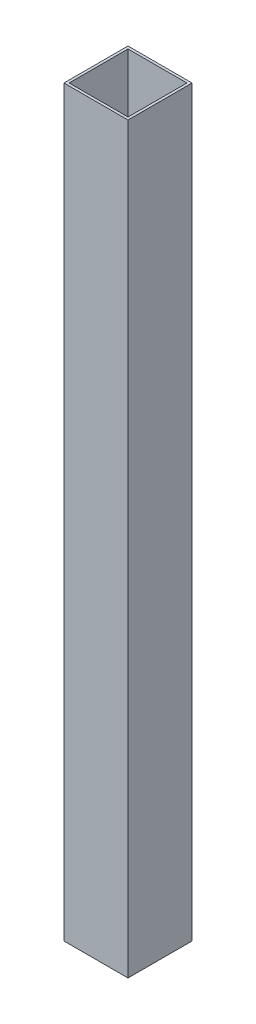
ISO-10303-21;
HEADER;
FILE_DESCRIPTION(('STEP AP214'),'2;1');
FILE_NAME('part.step','',(''),(''),'','','');
FILE_SCHEMA(('AUTOMOTIVE_DESIGN { 1 0 10303 214 1 1 1 1 }'));
ENDSEC;
DATA;
#1=APPLICATION_CONTEXT('core data for automotive mechanical design processes');
#2=APPLICATION_PROTOCOL_DEFINITION('international standard','automotive_design',2000,#1);
#3=PRODUCT_CONTEXT('',#1,'mechanical');
#4=PRODUCT('Part','Part','',(#3));
#5=PRODUCT_RELATED_PRODUCT_CATEGORY('part','',(#4));
#6=PRODUCT_DEFINITION_FORMATION('','',#4);
#7=PRODUCT_DEFINITION_CONTEXT('part definition',#1,'design');
#8=PRODUCT_DEFINITION('design','',#6,#7);
#9=PRODUCT_DEFINITION_SHAPE('','',#8);
#10=(LENGTH_UNIT() NAMED_UNIT(*) SI_UNIT(.MILLI.,.METRE.));
#11=(NAMED_UNIT(*) PLANE_ANGLE_UNIT() SI_UNIT($,.RADIAN.));
#12=(NAMED_UNIT(*) SI_UNIT($,.STERADIAN.) SOLID_ANGLE_UNIT());
#13=UNCERTAINTY_MEASURE_WITH_UNIT(LENGTH_MEASURE(1.E-05),#10,'distance_accuracy_value','');
#14=(GEOMETRIC_REPRESENTATION_CONTEXT(3) GLOBAL_UNCERTAINTY_ASSIGNED_CONTEXT((#13)) GLOBAL_UNIT_ASSIGNED_CONTEXT((#10,
#11,#12)) REPRESENTATION_CONTEXT('',''));
#15=CARTESIAN_POINT('',(0.,0.,0.));
#16=DIRECTION('',(0.,0.,1.));
#17=DIRECTION('',(1.,0.,0.));
#18=AXIS2_PLACEMENT_3D('',#15,#16,#17);
#19=CARTESIAN_POINT('',(230.57007751893,-229.386109851246,25.));
#20=DIRECTION('',(1.,0.,0.));
#21=DIRECTION('',(0.,0.,-1.));
#22=AXIS2_PLACEMENT_3D('',#19,#20,#21);
#23=PLANE('',#22);
#24=DIRECTION('',(0.,-1.,0.));
#25=VECTOR('',#24,1.);
#26=CARTESIAN_POINT('',(230.57007751893,-229.386109851246,0.));
#27=LINE('',#26,#25);
#28=CARTESIAN_POINT('',(230.57007751893,60.6138901487544,0.));
#29=VERTEX_POINT('',#28);
#30=CARTESIAN_POINT('',(230.57007751893,-229.386109851246,0.));
#31=VERTEX_POINT('',#30);
#32=EDGE_CURVE('E130',#29,#31,#27,.T.);
#33=ORIENTED_EDGE('',*,*,#32,.T.);
#34=DIRECTION('',(0.,0.,-1.));
#35=VECTOR('',#34,1.);
#36=CARTESIAN_POINT('',(230.57007751893,-229.386109851246,25.));
#37=LINE('',#36,#35);
#38=CARTESIAN_POINT('',(230.57007751893,-229.386109851246,25.));
#39=VERTEX_POINT('',#38);
#40=EDGE_CURVE('E11',#39,#31,#37,.T.);
#41=ORIENTED_EDGE('',*,*,#40,.F.);
#42=DIRECTION('',(0.,-1.,0.));
#43=VECTOR('',#42,1.);
#44=CARTESIAN_POINT('',(230.57007751893,-229.386109851246,25.));
#45=LINE('',#44,#43);
#46=CARTESIAN_POINT('',(230.57007751893,60.6138901487544,25.));
#47=VERTEX_POINT('',#46);
#48=EDGE_CURVE('E134',#47,#39,#45,.T.);
#49=ORIENTED_EDGE('',*,*,#48,.F.);
#50=DIRECTION('',(0.,0.,-1.));
#51=VECTOR('',#50,1.);
#52=CARTESIAN_POINT('',(230.57007751893,60.6138901487544,25.));
#53=LINE('',#52,#51);
#54=EDGE_CURVE('E144',#47,#29,#53,.T.);
#55=ORIENTED_EDGE('',*,*,#54,.T.);
#56=EDGE_LOOP('',(#33,#41,#49,#55));
#57=FACE_BOUND('',#56,.T.);
#58=ADVANCED_FACE('F33',(#57),#23,.F.);
#59=CARTESIAN_POINT('',(230.57007751893,-229.386109851246,25.));
#60=DIRECTION('',(0.,1.,0.));
#61=DIRECTION('',(0.,0.,1.));
#62=AXIS2_PLACEMENT_3D('',#59,#60,#61);
#63=PLANE('',#62);
#64=DIRECTION('',(1.,0.,0.));
#65=VECTOR('',#64,1.);
#66=CARTESIAN_POINT('',(254.57007751893,-229.386109851246,24.));
#67=LINE('',#66,#65);
#68=CARTESIAN_POINT('',(231.57007751893,-229.386109851246,24.));
#69=VERTEX_POINT('',#68);
#70=CARTESIAN_POINT('',(254.57007751893,-229.386109851246,24.));
#71=VERTEX_POINT('',#70);
#72=EDGE_CURVE('E105',#69,#71,#67,.T.);
#73=ORIENTED_EDGE('',*,*,#72,.T.);
#74=DIRECTION('',(0.,0.,-1.));
#75=VECTOR('',#74,1.);
#76=CARTESIAN_POINT('',(254.57007751893,-229.386109851246,24.));
#77=LINE('',#76,#75);
#78=CARTESIAN_POINT('',(254.57007751893,-229.386109851246,1.));
#79=VERTEX_POINT('',#78);
#80=EDGE_CURVE('E99',#71,#79,#77,.T.);
#81=ORIENTED_EDGE('',*,*,#80,.T.);
#82=DIRECTION('',(-1.,0.,0.));
#83=VECTOR('',#82,1.);
#84=CARTESIAN_POINT('',(254.57007751893,-229.386109851246,1.));
#85=LINE('',#84,#83);
#86=CARTESIAN_POINT('',(231.57007751893,-229.386109851246,1.));
#87=VERTEX_POINT('',#86);
#88=EDGE_CURVE('E108',#79,#87,#85,.T.);
#89=ORIENTED_EDGE('',*,*,#88,.T.);
#90=DIRECTION('',(0.,0.,1.));
#91=VECTOR('',#90,1.);
#92=CARTESIAN_POINT('',(231.57007751893,-229.386109851246,24.));
#93=LINE('',#92,#91);
#94=EDGE_CURVE('E47',#87,#69,#93,.T.);
#95=ORIENTED_EDGE('',*,*,#94,.T.);
#96=EDGE_LOOP('',(#73,#81,#89,#95));
#97=FACE_BOUND('',#96,.T.);
#98=DIRECTION('',(1.,0.,0.));
#99=VECTOR('',#98,1.);
#100=CARTESIAN_POINT('',(230.57007751893,-229.386109851246,0.));
#101=LINE('',#100,#99);
#102=CARTESIAN_POINT('',(255.57007751893,-229.386109851246,0.));
#103=VERTEX_POINT('',#102);
#104=EDGE_CURVE('E147',#31,#103,#101,.T.);
#105=ORIENTED_EDGE('',*,*,#104,.T.);
#106=DIRECTION('',(0.,0.,-1.));
#107=VECTOR('',#106,1.);
#108=CARTESIAN_POINT('',(255.57007751893,-229.386109851246,25.));
#109=LINE('',#108,#107);
#110=CARTESIAN_POINT('',(255.57007751893,-229.386109851246,25.));
#111=VERTEX_POINT('',#110);
#112=EDGE_CURVE('E40',#111,#103,#109,.T.);
#113=ORIENTED_EDGE('',*,*,#112,.F.);
#114=DIRECTION('',(1.,0.,0.));
#115=VECTOR('',#114,1.);
#116=CARTESIAN_POINT('',(230.57007751893,-229.386109851246,25.));
#117=LINE('',#116,#115);
#118=EDGE_CURVE('E137',#39,#111,#117,.T.);
#119=ORIENTED_EDGE('',*,*,#118,.F.);
#120=ORIENTED_EDGE('',*,*,#40,.T.);
#121=EDGE_LOOP('',(#105,#113,#119,#120));
#122=FACE_BOUND('',#121,.T.);
#123=ADVANCED_FACE('F112',(#97,#122),#63,.F.);
#124=CARTESIAN_POINT('',(255.57007751893,-229.386109851246,25.));
#125=DIRECTION('',(-1.,0.,0.));
#126=DIRECTION('',(0.,0.,1.));
#127=AXIS2_PLACEMENT_3D('',#124,#125,#126);
#128=PLANE('',#127);
#129=DIRECTION('',(0.,1.,0.));
#130=VECTOR('',#129,1.);
#131=CARTESIAN_POINT('',(255.57007751893,-229.386109851246,0.));
#132=LINE('',#131,#130);
#133=CARTESIAN_POINT('',(255.57007751893,60.6138901487544,0.));
#134=VERTEX_POINT('',#133);
#135=EDGE_CURVE('E149',#103,#134,#132,.T.);
#136=ORIENTED_EDGE('',*,*,#135,.T.);
#137=DIRECTION('',(0.,0.,-1.));
#138=VECTOR('',#137,1.);
#139=CARTESIAN_POINT('',(255.57007751893,60.6138901487544,25.));
#140=LINE('',#139,#138);
#141=CARTESIAN_POINT('',(255.57007751893,60.6138901487544,25.));
#142=VERTEX_POINT('',#141);
#143=EDGE_CURVE('E154',#142,#134,#140,.T.);
#144=ORIENTED_EDGE('',*,*,#143,.F.);
#145=DIRECTION('',(0.,1.,0.));
#146=VECTOR('',#145,1.);
#147=CARTESIAN_POINT('',(255.57007751893,-229.386109851246,25.));
#148=LINE('',#147,#146);
#149=EDGE_CURVE('E140',#111,#142,#148,.T.);
#150=ORIENTED_EDGE('',*,*,#149,.F.);
#151=ORIENTED_EDGE('',*,*,#112,.T.);
#152=EDGE_LOOP('',(#136,#144,#150,#151));
#153=FACE_BOUND('',#152,.T.);
#154=ADVANCED_FACE('F161',(#153),#128,.F.);
#155=CARTESIAN_POINT('',(230.57007751893,60.6138901487544,25.));
#156=DIRECTION('',(0.,-1.,0.));
#157=DIRECTION('',(0.,0.,-1.));
#158=AXIS2_PLACEMENT_3D('',#155,#156,#157);
#159=PLANE('',#158);
#160=DIRECTION('',(-1.,0.,0.));
#161=VECTOR('',#160,1.);
#162=CARTESIAN_POINT('',(254.57007751893,60.6138901487544,1.));
#163=LINE('',#162,#161);
#164=CARTESIAN_POINT('',(254.57007751893,60.6138901487544,1.));
#165=VERTEX_POINT('',#164);
#166=CARTESIAN_POINT('',(231.57007751893,60.6138901487544,1.));
#167=VERTEX_POINT('',#166);
#168=EDGE_CURVE('E124',#165,#167,#163,.T.);
#169=ORIENTED_EDGE('',*,*,#168,.F.);
#170=DIRECTION('',(0.,0.,-1.));
#171=VECTOR('',#170,1.);
#172=CARTESIAN_POINT('',(254.57007751893,60.6138901487544,24.));
#173=LINE('',#172,#171);
#174=CARTESIAN_POINT('',(254.57007751893,60.6138901487544,24.));
#175=VERTEX_POINT('',#174);
#176=EDGE_CURVE('E55',#175,#165,#173,.T.);
#177=ORIENTED_EDGE('',*,*,#176,.F.);
#178=DIRECTION('',(1.,0.,0.));
#179=VECTOR('',#178,1.);
#180=CARTESIAN_POINT('',(254.57007751893,60.6138901487544,24.));
#181=LINE('',#180,#179);
#182=CARTESIAN_POINT('',(231.57007751893,60.6138901487544,24.));
#183=VERTEX_POINT('',#182);
#184=EDGE_CURVE('E115',#183,#175,#181,.T.);
#185=ORIENTED_EDGE('',*,*,#184,.F.);
#186=DIRECTION('',(0.,0.,1.));
#187=VECTOR('',#186,1.);
#188=CARTESIAN_POINT('',(231.57007751893,60.6138901487544,24.));
#189=LINE('',#188,#187);
#190=EDGE_CURVE('E118',#167,#183,#189,.T.);
#191=ORIENTED_EDGE('',*,*,#190,.F.);
#192=EDGE_LOOP('',(#169,#177,#185,#191));
#193=FACE_BOUND('',#192,.T.);
#194=DIRECTION('',(-1.,0.,0.));
#195=VECTOR('',#194,1.);
#196=CARTESIAN_POINT('',(230.57007751893,60.6138901487544,0.));
#197=LINE('',#196,#195);
#198=EDGE_CURVE('E138',#134,#29,#197,.T.);
#199=ORIENTED_EDGE('',*,*,#198,.T.);
#200=ORIENTED_EDGE('',*,*,#54,.F.);
#201=DIRECTION('',(-1.,0.,0.));
#202=VECTOR('',#201,1.);
#203=CARTESIAN_POINT('',(230.57007751893,60.6138901487544,25.));
#204=LINE('',#203,#202);
#205=EDGE_CURVE('E142',#142,#47,#204,.T.);
#206=ORIENTED_EDGE('',*,*,#205,.F.);
#207=ORIENTED_EDGE('',*,*,#143,.T.);
#208=EDGE_LOOP('',(#199,#200,#206,#207));
#209=FACE_BOUND('',#208,.T.);
#210=ADVANCED_FACE('F169',(#193,#209),#159,.F.);
#211=CARTESIAN_POINT('',(0.,0.,25.));
#212=DIRECTION('',(0.,0.,-1.));
#213=DIRECTION('',(-1.,0.,0.));
#214=AXIS2_PLACEMENT_3D('',#211,#212,#213);
#215=PLANE('',#214);
#216=ORIENTED_EDGE('',*,*,#48,.T.);
#217=ORIENTED_EDGE('',*,*,#118,.T.);
#218=ORIENTED_EDGE('',*,*,#149,.T.);
#219=ORIENTED_EDGE('',*,*,#205,.T.);
#220=EDGE_LOOP('',(#216,#217,#218,#219));
#221=FACE_BOUND('',#220,.T.);
#222=ADVANCED_FACE('F175',(#221),#215,.F.);
#223=CARTESIAN_POINT('',(0.,0.,0.));
#224=DIRECTION('',(0.,0.,-1.));
#225=DIRECTION('',(-1.,0.,0.));
#226=AXIS2_PLACEMENT_3D('',#223,#224,#225);
#227=PLANE('',#226);
#228=ORIENTED_EDGE('',*,*,#32,.F.);
#229=ORIENTED_EDGE('',*,*,#198,.F.);
#230=ORIENTED_EDGE('',*,*,#135,.F.);
#231=ORIENTED_EDGE('',*,*,#104,.F.);
#232=EDGE_LOOP('',(#228,#229,#230,#231));
#233=FACE_BOUND('',#232,.T.);
#234=ADVANCED_FACE('F166',(#233),#227,.T.);
#235=CARTESIAN_POINT('',(254.57007751893,-229.386109851246,24.));
#236=DIRECTION('',(1.,0.,0.));
#237=DIRECTION('',(0.,0.,-1.));
#238=AXIS2_PLACEMENT_3D('',#235,#236,#237);
#239=PLANE('',#238);
#240=ORIENTED_EDGE('',*,*,#176,.T.);
#241=DIRECTION('',(0.,1.,0.));
#242=VECTOR('',#241,1.);
#243=CARTESIAN_POINT('',(254.57007751893,-229.386109851246,1.));
#244=LINE('',#243,#242);
#245=EDGE_CURVE('E95',#79,#165,#244,.T.);
#246=ORIENTED_EDGE('',*,*,#245,.F.);
#247=ORIENTED_EDGE('',*,*,#80,.F.);
#248=DIRECTION('',(0.,1.,0.));
#249=VECTOR('',#248,1.);
#250=CARTESIAN_POINT('',(254.57007751893,-229.386109851246,24.));
#251=LINE('',#250,#249);
#252=EDGE_CURVE('E128',#71,#175,#251,.T.);
#253=ORIENTED_EDGE('',*,*,#252,.T.);
#254=EDGE_LOOP('',(#240,#246,#247,#253));
#255=FACE_BOUND('',#254,.T.);
#256=ADVANCED_FACE('F97',(#255),#239,.F.);
#257=CARTESIAN_POINT('',(254.57007751893,-229.386109851246,24.));
#258=DIRECTION('',(0.,0.,1.));
#259=DIRECTION('',(1.,0.,0.));
#260=AXIS2_PLACEMENT_3D('',#257,#258,#259);
#261=PLANE('',#260);
#262=ORIENTED_EDGE('',*,*,#184,.T.);
#263=ORIENTED_EDGE('',*,*,#252,.F.);
#264=ORIENTED_EDGE('',*,*,#72,.F.);
#265=DIRECTION('',(0.,1.,0.));
#266=VECTOR('',#265,1.);
#267=CARTESIAN_POINT('',(231.57007751893,-229.386109851246,24.));
#268=LINE('',#267,#266);
#269=EDGE_CURVE('E131',#69,#183,#268,.T.);
#270=ORIENTED_EDGE('',*,*,#269,.T.);
#271=EDGE_LOOP('',(#262,#263,#264,#270));
#272=FACE_BOUND('',#271,.T.);
#273=ADVANCED_FACE('F192',(#272),#261,.F.);
#274=CARTESIAN_POINT('',(231.57007751893,-229.386109851246,24.));
#275=DIRECTION('',(-1.,0.,0.));
#276=DIRECTION('',(0.,0.,1.));
#277=AXIS2_PLACEMENT_3D('',#274,#275,#276);
#278=PLANE('',#277);
#279=ORIENTED_EDGE('',*,*,#190,.T.);
#280=ORIENTED_EDGE('',*,*,#269,.F.);
#281=ORIENTED_EDGE('',*,*,#94,.F.);
#282=DIRECTION('',(0.,1.,0.));
#283=VECTOR('',#282,1.);
#284=CARTESIAN_POINT('',(231.57007751893,-229.386109851246,1.));
#285=LINE('',#284,#283);
#286=EDGE_CURVE('E104',#87,#167,#285,.T.);
#287=ORIENTED_EDGE('',*,*,#286,.T.);
#288=EDGE_LOOP('',(#279,#280,#281,#287));
#289=FACE_BOUND('',#288,.T.);
#290=ADVANCED_FACE('F195',(#289),#278,.F.);
#291=CARTESIAN_POINT('',(254.57007751893,-229.386109851246,1.));
#292=DIRECTION('',(0.,0.,-1.));
#293=DIRECTION('',(-1.,0.,0.));
#294=AXIS2_PLACEMENT_3D('',#291,#292,#293);
#295=PLANE('',#294);
#296=ORIENTED_EDGE('',*,*,#168,.T.);
#297=ORIENTED_EDGE('',*,*,#286,.F.);
#298=ORIENTED_EDGE('',*,*,#88,.F.);
#299=ORIENTED_EDGE('',*,*,#245,.T.);
#300=EDGE_LOOP('',(#296,#297,#298,#299));
#301=FACE_BOUND('',#300,.T.);
#302=ADVANCED_FACE('F109',(#301),#295,.F.);
#303=CLOSED_SHELL('',(#58,#123,#154,#210,#222,#234,#256,#273,#290,#302));
#304=MANIFOLD_SOLID_BREP('B2',#303);
#305=ADVANCED_BREP_SHAPE_REPRESENTATION('',(#18,#304),#14);
#306=SHAPE_DEFINITION_REPRESENTATION(#9,#305);
ENDSEC;
END-ISO-10303-21;
